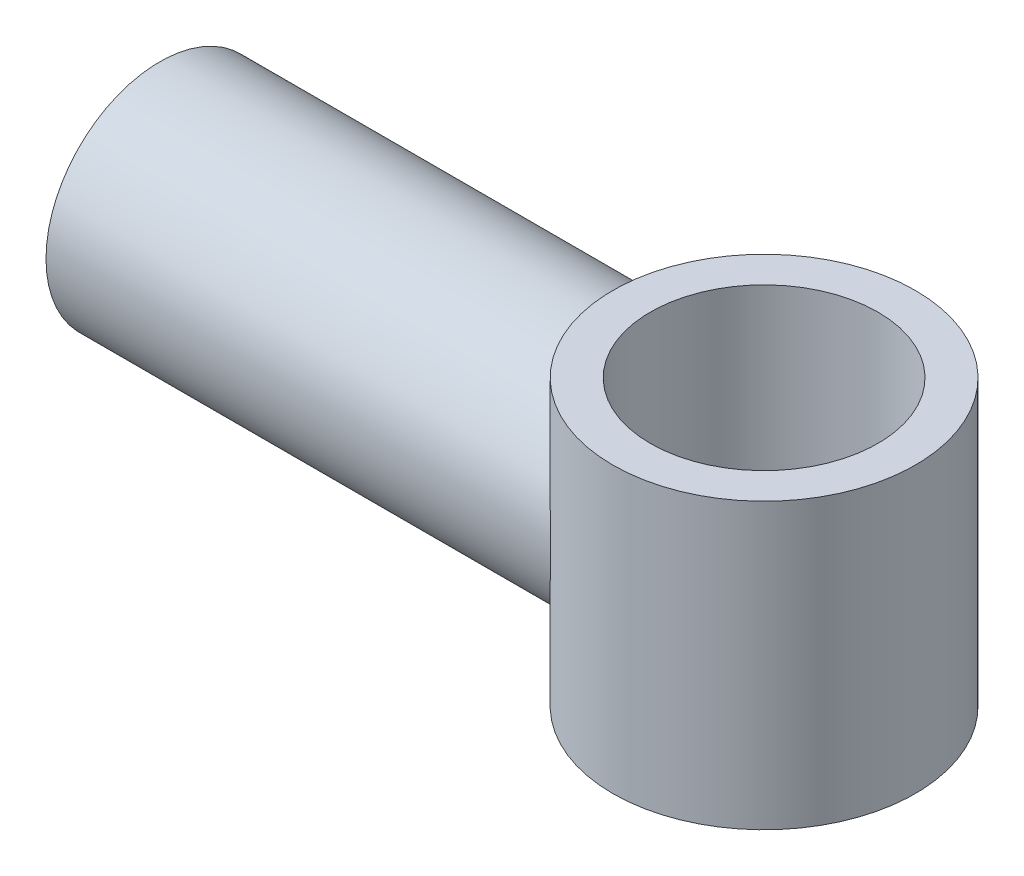
ISO-10303-21;
HEADER;
FILE_DESCRIPTION(('STEP AP214'),'2;1');
FILE_NAME('part.step','',(''),(''),'','','');
FILE_SCHEMA(('AUTOMOTIVE_DESIGN { 1 0 10303 214 1 1 1 1 }'));
ENDSEC;
DATA;
#1=APPLICATION_CONTEXT('core data for automotive mechanical design processes');
#2=APPLICATION_PROTOCOL_DEFINITION('international standard','automotive_design',2000,#1);
#3=PRODUCT_CONTEXT('',#1,'mechanical');
#4=PRODUCT('Part','Part','',(#3));
#5=PRODUCT_RELATED_PRODUCT_CATEGORY('part','',(#4));
#6=PRODUCT_DEFINITION_FORMATION('','',#4);
#7=PRODUCT_DEFINITION_CONTEXT('part definition',#1,'design');
#8=PRODUCT_DEFINITION('design','',#6,#7);
#9=PRODUCT_DEFINITION_SHAPE('','',#8);
#10=(LENGTH_UNIT() NAMED_UNIT(*) SI_UNIT(.MILLI.,.METRE.));
#11=(NAMED_UNIT(*) PLANE_ANGLE_UNIT() SI_UNIT($,.RADIAN.));
#12=(NAMED_UNIT(*) SI_UNIT($,.STERADIAN.) SOLID_ANGLE_UNIT());
#13=UNCERTAINTY_MEASURE_WITH_UNIT(LENGTH_MEASURE(1.E-05),#10,'distance_accuracy_value','');
#14=(GEOMETRIC_REPRESENTATION_CONTEXT(3) GLOBAL_UNCERTAINTY_ASSIGNED_CONTEXT((#13)) GLOBAL_UNIT_ASSIGNED_CONTEXT((#10,
#11,#12)) REPRESENTATION_CONTEXT('',''));
#15=CARTESIAN_POINT('',(0.,0.,0.));
#16=DIRECTION('',(0.,0.,1.));
#17=DIRECTION('',(1.,0.,0.));
#18=AXIS2_PLACEMENT_3D('',#15,#16,#17);
#19=CARTESIAN_POINT('',(0.,50.,0.));
#20=DIRECTION('',(0.,-1.,0.));
#21=DIRECTION('',(0.,0.,-1.));
#22=AXIS2_PLACEMENT_3D('',#19,#20,#21);
#23=CYLINDRICAL_SURFACE('',#22,53.1717026701568);
#24=CARTESIAN_POINT('',(0.,50.,0.));
#25=DIRECTION('',(0.,1.,0.));
#26=DIRECTION('',(0.,0.,1.));
#27=AXIS2_PLACEMENT_3D('',#24,#25,#26);
#28=CIRCLE('',#27,53.1717026701568);
#29=CARTESIAN_POINT('',(0.,50.,53.1717026701568));
#30=VERTEX_POINT('',#29);
#31=EDGE_CURVE('E49',#30,#30,#28,.T.);
#32=ORIENTED_EDGE('',*,*,#31,.F.);
#33=EDGE_LOOP('',(#32));
#34=FACE_BOUND('',#33,.T.);
#35=CARTESIAN_POINT('',(0.,-50.,0.));
#36=DIRECTION('',(0.,1.,0.));
#37=DIRECTION('',(0.,0.,1.));
#38=AXIS2_PLACEMENT_3D('',#35,#36,#37);
#39=CIRCLE('',#38,53.1717026701568);
#40=CARTESIAN_POINT('',(0.,-50.,53.1717026701568));
#41=VERTEX_POINT('',#40);
#42=EDGE_CURVE('E59',#41,#41,#39,.T.);
#43=ORIENTED_EDGE('',*,*,#42,.T.);
#44=EDGE_LOOP('',(#43));
#45=FACE_BOUND('',#44,.T.);
#46=CARTESIAN_POINT('',(-35.0318421560094,0.,40.));
#47=CARTESIAN_POINT('',(-35.0318360080921,0.466224832032186,40.0000029720039));
#48=CARTESIAN_POINT('',(-35.0411594107739,0.932404201727975,39.9918451445251));
#49=CARTESIAN_POINT('',(-35.0782886299255,1.86350962572313,39.9592828391426));
#50=CARTESIAN_POINT('',(-35.1060958003306,2.32843558570521,39.9348771710849));
#51=CARTESIAN_POINT('',(-35.1797748030917,3.25580537536783,39.8699864206307));
#52=CARTESIAN_POINT('',(-35.225649832424,3.71824875108666,39.8294984925842));
#53=CARTESIAN_POINT('',(-35.3347560969348,4.6394438489395,39.732734849922));
#54=CARTESIAN_POINT('',(-35.3979898411727,5.09819502752242,39.6764568529555));
#55=CARTESIAN_POINT('',(-35.612760760513,6.46945389131752,39.4841581380373));
#56=CARTESIAN_POINT('',(-35.7892036432933,7.37497997075151,39.3248137191437));
#57=CARTESIAN_POINT('',(-36.1992044252015,9.16016553642685,38.9477163480024));
#58=CARTESIAN_POINT('',(-36.4327639813452,10.0398242713994,38.7299617011939));
#59=CARTESIAN_POINT('',(-36.9431794562528,11.7571789778651,38.2433506456049));
#60=CARTESIAN_POINT('',(-37.2193696711163,12.5952947332021,37.9752681501788));
#61=CARTESIAN_POINT('',(-37.8078877948816,14.2406793213602,37.3893820283716));
#62=CARTESIAN_POINT('',(-38.1202147600129,15.0479489590463,37.0715797004293));
#63=CARTESIAN_POINT('',(-38.7722099756859,16.6305156876167,36.3891232481217));
#64=CARTESIAN_POINT('',(-39.1118685472709,17.4058239511874,36.0244856825088));
#65=CARTESIAN_POINT('',(-39.8109399008158,18.924464155715,35.2504058718305));
#66=CARTESIAN_POINT('',(-40.1703541236829,19.667793757194,34.840960356468));
#67=CARTESIAN_POINT('',(-40.9794726096933,21.2759759710889,33.8877793572696));
#68=CARTESIAN_POINT('',(-41.432211840636,22.1333300076736,33.3339468749483));
#69=CARTESIAN_POINT('',(-42.3461925373751,23.8003306416804,32.1648990643538));
#70=CARTESIAN_POINT('',(-42.807434702202,24.6099732935555,31.5496786708363));
#71=CARTESIAN_POINT('',(-43.7298156801524,26.1815205302343,30.2582832508677));
#72=CARTESIAN_POINT('',(-44.1909534174534,26.9433557293265,29.5820229506732));
#73=CARTESIAN_POINT('',(-45.1040128595465,28.4161162965938,28.1702831245609));
#74=CARTESIAN_POINT('',(-45.5559337896224,29.127037397709,27.4347986460715));
#75=CARTESIAN_POINT('',(-46.5341027759152,30.6363848648543,25.7477009563643));
#76=CARTESIAN_POINT('',(-47.0564398829022,31.4225867584502,24.7828109656896));
#77=CARTESIAN_POINT('',(-48.0626175511641,32.9102604318116,22.7701571015477));
#78=CARTESIAN_POINT('',(-48.546449369092,33.6117129862816,21.7223745128566));
#79=CARTESIAN_POINT('',(-49.2325188285781,34.5928488345494,20.0931838593558));
#80=CARTESIAN_POINT('',(-49.4544363268698,34.9078333289829,19.5409918691915));
#81=CARTESIAN_POINT('',(-49.8836370299662,35.5132782702058,18.4177626039244));
#82=CARTESIAN_POINT('',(-50.0909211249927,35.8037402090337,17.8467264783096));
#83=CARTESIAN_POINT('',(-50.4890916018598,36.3587091726904,16.6870381501323));
#84=CARTESIAN_POINT('',(-50.6799873944133,36.6232311057264,16.0983963227943));
#85=CARTESIAN_POINT('',(-51.0439606337523,37.1252722218448,14.9041561041875));
#86=CARTESIAN_POINT('',(-51.217033842119,37.3627849832245,14.2985537228543));
#87=CARTESIAN_POINT('',(-51.607976072231,37.897207337992,12.8307510913545));
#88=CARTESIAN_POINT('',(-51.8167340239405,38.1807974266192,11.96120611244));
#89=CARTESIAN_POINT('',(-52.1926733810507,38.6894632035225,10.1964794807991));
#90=CARTESIAN_POINT('',(-52.359864754566,38.9145529214083,9.30130403207072));
#91=CARTESIAN_POINT('',(-52.5769688335236,39.2060175768601,7.94370912894988));
#92=CARTESIAN_POINT('',(-52.6437142135703,39.2954657512606,7.48878719608915));
#93=CARTESIAN_POINT('',(-52.7656698076283,39.458698458359,6.57469813441233));
#94=CARTESIAN_POINT('',(-52.8208821347961,39.5324858605592,6.11553179941));
#95=CARTESIAN_POINT('',(-52.9687747568763,39.7299499153759,4.73262095303129));
#96=CARTESIAN_POINT('',(-53.0437250364697,39.8297476222911,3.8033753915287));
#97=CARTESIAN_POINT('',(-53.1447355973682,39.9641701424517,1.935151902209));
#98=CARTESIAN_POINT('',(-53.1706656596019,39.9986213677554,0.996154696161827));
#99=CARTESIAN_POINT('',(-53.1726784288906,40.0012972106355,-0.882016832105329));
#100=CARTESIAN_POINT('',(-53.1487613338823,39.9695220911883,-1.8211911536072));
#101=CARTESIAN_POINT('',(-53.051606426265,39.8402408009734,-3.69258679848788));
#102=CARTESIAN_POINT('',(-52.9783589721413,39.7427217806953,-4.62480672662615));
#103=CARTESIAN_POINT('',(-52.784156858037,39.483472721843,-6.47519798718179));
#104=CARTESIAN_POINT('',(-52.6632025325488,39.3217431334754,-7.39336941805206));
#105=CARTESIAN_POINT('',(-52.3811786737568,38.9432055112751,-9.1776550625902));
#106=CARTESIAN_POINT('',(-52.2216576808397,38.7285183381711,-10.0444674342689));
#107=CARTESIAN_POINT('',(-51.863567213659,38.2442962262208,-11.7542898246623));
#108=CARTESIAN_POINT('',(-51.6649989299066,37.9747629595659,-12.5973005681679));
#109=CARTESIAN_POINT('',(-51.2322457863857,37.383867009987,-14.2555743097466));
#110=CARTESIAN_POINT('',(-50.9980576804767,37.0624996031021,-15.0708347705585));
#111=CARTESIAN_POINT('',(-50.4978421998425,36.3711291587959,-16.6703398592023));
#112=CARTESIAN_POINT('',(-50.2318129415964,36.0011232441011,-17.454582648571));
#113=CARTESIAN_POINT('',(-49.6416257803749,35.1732035914988,-19.0724465314118));
#114=CARTESIAN_POINT('',(-49.3142929824772,34.7101119516588,-19.9022589790938));
#115=CARTESIAN_POINT('',(-48.6308820451753,33.7321078532698,-21.5182980934576));
#116=CARTESIAN_POINT('',(-48.2748021580392,33.2171922435175,-22.3045221051917));
#117=CARTESIAN_POINT('',(-47.5391977144989,32.1387769734327,-23.8322017510882));
#118=CARTESIAN_POINT('',(-47.1596574063362,31.5752445681927,-24.5736266310381));
#119=CARTESIAN_POINT('',(-46.3829453549651,30.4029666998105,-26.0099806743957));
#120=CARTESIAN_POINT('',(-45.9857727767498,29.7942190945028,-26.7049076318975));
#121=CARTESIAN_POINT('',(-45.0998355289723,28.4095390964178,-28.1800231074979));
#122=CARTESIAN_POINT('',(-44.608468344886,27.6243267346731,-28.9499596224516));
#123=CARTESIAN_POINT('',(-43.6186582700293,25.9956882913211,-30.4208580301369));
#124=CARTESIAN_POINT('',(-43.12021403764,25.1522510515604,-31.1218066393187));
#125=CARTESIAN_POINT('',(-42.1270206220268,23.4087534493967,-32.4535725757241));
#126=CARTESIAN_POINT('',(-41.6322736492788,22.5086618398324,-33.0843506608677));
#127=CARTESIAN_POINT('',(-40.6591793084432,20.6533975440956,-34.2731777220485));
#128=CARTESIAN_POINT('',(-40.1808283596298,19.6982370082119,-34.8312426534471));
#129=CARTESIAN_POINT('',(-39.3450307556117,17.9245099876765,-35.7702856781267));
#130=CARTESIAN_POINT('',(-38.9821717661404,17.1155366437212,-36.1645908712928));
#131=CARTESIAN_POINT('',(-38.2851409139984,15.4623354377748,-36.9016958186341));
#132=CARTESIAN_POINT('',(-37.9509688373177,14.6181078388571,-37.2444959570613));
#133=CARTESIAN_POINT('',(-37.3218539244472,12.8969424054593,-37.8748891117213));
#134=CARTESIAN_POINT('',(-37.0268394735577,12.0200681481467,-38.1625833495648));
#135=CARTESIAN_POINT('',(-36.4862972422397,10.2344013110003,-38.6797135282512));
#136=CARTESIAN_POINT('',(-36.2407562546812,9.32561732586308,-38.9091650214778));
#137=CARTESIAN_POINT('',(-35.853806896015,7.66670193010667,-39.2656218205582));
#138=CARTESIAN_POINT('',(-35.7013836370996,6.92156928759879,-39.4039570530465));
#139=CARTESIAN_POINT('',(-35.4404679344914,5.41711725952516,-39.6387960263289));
#140=CARTESIAN_POINT('',(-35.3319698277185,4.65779971597118,-39.7353051596946));
#141=CARTESIAN_POINT('',(-35.1632464712631,3.13037483314393,-39.8846944516366));
#142=CARTESIAN_POINT('',(-35.1029669707247,2.36227836115537,-39.9376236440682));
#143=CARTESIAN_POINT('',(-35.0330387076899,0.821969296647718,-39.9989797792235));
#144=CARTESIAN_POINT('',(-35.0233903948934,0.0497566676304017,-40.0074063266801));
#145=CARTESIAN_POINT('',(-35.0551610851182,-1.49319643907149,-39.9795706246441));
#146=CARTESIAN_POINT('',(-35.0966066521932,-2.26393594214417,-39.9432851290625));
#147=CARTESIAN_POINT('',(-35.2288081499679,-3.79775584836028,-39.8267336288623));
#148=CARTESIAN_POINT('',(-35.3195641459339,-4.56083624136489,-39.7464675660319));
#149=CARTESIAN_POINT('',(-35.5468674994627,-6.07548251228212,-39.5433093594356));
#150=CARTESIAN_POINT('',(-35.6834821524419,-6.82702976104223,-39.4203545628194));
#151=CARTESIAN_POINT('',(-35.9974762478346,-8.31364188532907,-39.1338309538183));
#152=CARTESIAN_POINT('',(-36.1748614563569,-9.0487044132955,-38.9702563963878));
#153=CARTESIAN_POINT('',(-36.6370586783061,-10.7685316055741,-38.5368651796099));
#154=CARTESIAN_POINT('',(-36.9373226336699,-11.7449089725073,-38.2501397277851));
#155=CARTESIAN_POINT('',(-37.5892635010574,-13.6576929120285,-37.6096507957327));
#156=CARTESIAN_POINT('',(-37.9409611316848,-14.5940831796226,-37.2558602831478));
#157=CARTESIAN_POINT('',(-38.6826891184745,-16.4262959242527,-36.4851465049999));
#158=CARTESIAN_POINT('',(-39.0727723001078,-17.3220599456737,-36.0681357982815));
#159=CARTESIAN_POINT('',(-39.8789377127442,-19.0709703537436,-35.1747399553402));
#160=CARTESIAN_POINT('',(-40.2950176089611,-19.9241205552263,-34.6983601472936));
#161=CARTESIAN_POINT('',(-41.1582782323898,-21.6176681528708,-33.6703536188596));
#162=CARTESIAN_POINT('',(-41.6060394188574,-22.4564961892298,-33.1166328753988));
#163=CARTESIAN_POINT('',(-42.5086466067456,-24.0876822413821,-31.9497905258514));
#164=CARTESIAN_POINT('',(-42.9634926318787,-24.8800401015997,-31.3366687209166));
#165=CARTESIAN_POINT('',(-43.8717325407211,-26.4174887996174,-30.0519583100444));
#166=CARTESIAN_POINT('',(-44.3251256888976,-27.1625584658296,-29.3803438309081));
#167=CARTESIAN_POINT('',(-45.2222668195599,-28.6031625967915,-27.9797847809088));
#168=CARTESIAN_POINT('',(-45.6660136813662,-29.2986913271528,-27.250833593776));
#169=CARTESIAN_POINT('',(-46.6345744015206,-30.7886785986114,-25.565453279138));
#170=CARTESIAN_POINT('',(-47.1550582087986,-31.5699950116779,-24.5948344247164));
#171=CARTESIAN_POINT('',(-48.156635374486,-33.0473329598133,-22.5708408637969));
#172=CARTESIAN_POINT('',(-48.6377196068655,-33.7433347520997,-21.5174470944371));
#173=CARTESIAN_POINT('',(-49.3190473389076,-34.7158693755115,-19.879913044653));
#174=CARTESIAN_POINT('',(-49.5393068741024,-35.0279521778271,-19.3248830840766));
#175=CARTESIAN_POINT('',(-49.9649589525964,-35.6274018891344,-18.1960569586298));
#176=CARTESIAN_POINT('',(-50.1703523950925,-35.9147702932101,-17.6222619318442));
#177=CARTESIAN_POINT('',(-50.5645088667604,-36.4633508075648,-16.4571686107743));
#178=CARTESIAN_POINT('',(-50.7532815537196,-36.7245781198068,-15.8658807514771));
#179=CARTESIAN_POINT('',(-51.1127794568546,-37.2198234696975,-14.6664868870585));
#180=CARTESIAN_POINT('',(-51.2835003910554,-37.4538350529347,-14.058376934609));
#181=CARTESIAN_POINT('',(-51.667953125545,-37.9788195005444,-12.5870584415525));
#182=CARTESIAN_POINT('',(-51.8725702841782,-38.2565224342576,-11.7166659897105));
#183=CARTESIAN_POINT('',(-52.2400644744276,-38.7533526272376,-9.95080140282294));
#184=CARTESIAN_POINT('',(-52.4029515148419,-38.9724939328159,-9.0553353388444));
#185=CARTESIAN_POINT('',(-52.6135348982715,-39.2550373549052,-7.69777777266261));
#186=CARTESIAN_POINT('',(-52.6780954888575,-39.3415113225541,-7.24295597709865));
#187=CARTESIAN_POINT('',(-52.7956728377562,-39.498807966775,-6.32922344824953));
#188=CARTESIAN_POINT('',(-52.848691718261,-39.569633520681,-5.87031348284295));
#189=CARTESIAN_POINT('',(-52.990007470392,-39.7582449140969,-4.48841031304441));
#190=CARTESIAN_POINT('',(-53.0605772154392,-39.8521839027135,-3.56015558760101));
#191=CARTESIAN_POINT('',(-53.1529180730856,-39.9750465507398,-1.69467887382966));
#192=CARTESIAN_POINT('',(-53.1745655811245,-40.0038055300104,-0.757440166758745));
#193=CARTESIAN_POINT('',(-53.1682332506411,-39.9953882409211,1.11660030118069));
#194=CARTESIAN_POINT('',(-53.140253618109,-39.9582122462413,2.05340206384672));
#195=CARTESIAN_POINT('',(-53.0352806280193,-39.818502482677,3.9195191057059));
#196=CARTESIAN_POINT('',(-52.9582767923634,-39.7159547416761,4.84883274142821));
#197=CARTESIAN_POINT('',(-52.7569402686285,-39.44708751213,6.69294966523445));
#198=CARTESIAN_POINT('',(-52.6326078120582,-39.2807683355236,7.60775302427283));
#199=CARTESIAN_POINT('',(-52.3439549521517,-38.893133258867,9.38759878550881));
#200=CARTESIAN_POINT('',(-52.1810475566028,-38.6737558847546,10.2532956516811));
#201=CARTESIAN_POINT('',(-51.8163918675118,-38.1803106790798,11.9604940430041));
#202=CARTESIAN_POINT('',(-51.6146446807524,-37.9062444059298,12.8019962568231));
#203=CARTESIAN_POINT('',(-51.1757811586576,-37.3064658560145,14.4569144909532));
#204=CARTESIAN_POINT('',(-50.9386617629216,-36.9807491103004,15.2703280735316));
#205=CARTESIAN_POINT('',(-50.4328583848408,-36.2808727506215,16.8658627761094));
#206=CARTESIAN_POINT('',(-50.1641725320105,-35.9067102658469,17.6479820380639));
#207=CARTESIAN_POINT('',(-49.5679291534919,-35.0691533272017,19.2632071292691));
#208=CARTESIAN_POINT('',(-49.2371471169329,-34.6004663275331,20.092377707367));
#209=CARTESIAN_POINT('',(-48.5470899650096,-33.6112420686542,21.706699288438));
#210=CARTESIAN_POINT('',(-48.1878130659203,-33.0907015629889,22.491847530436));
#211=CARTESIAN_POINT('',(-47.4461065315283,-32.0009777687301,24.0170041255837));
#212=CARTESIAN_POINT('',(-47.0636604870155,-31.4317598848329,24.756979723289));
#213=CARTESIAN_POINT('',(-46.2815029287211,-30.2480558876961,26.1900547956911));
#214=CARTESIAN_POINT('',(-45.8817906113298,-29.6335676665366,26.8831520847102));
#215=CARTESIAN_POINT('',(-44.9904856700914,-28.2357705233634,28.354273517983));
#216=CARTESIAN_POINT('',(-44.4963752794658,-27.4431302261621,29.1219289724948));
#217=CARTESIAN_POINT('',(-43.5018374157537,-25.7993864143568,30.5876550313669));
#218=CARTESIAN_POINT('',(-43.0014087086427,-24.9482713302859,31.2857117979954));
#219=CARTESIAN_POINT('',(-42.0052388184928,-23.1891389116143,32.6109996638048));
#220=CARTESIAN_POINT('',(-41.5095001981257,-22.2810923272534,33.2381938844482));
#221=CARTESIAN_POINT('',(-40.5356854737325,-20.4095697932911,34.4190848655216));
#222=CARTESIAN_POINT('',(-40.0576051613389,-19.446107192366,34.9727992204702));
#223=CARTESIAN_POINT('',(-39.2285275602167,-17.6672802976508,35.8978502226892));
#224=CARTESIAN_POINT('',(-38.8715639067994,-16.8620250506228,36.2833081249911));
#225=CARTESIAN_POINT('',(-38.1867250432431,-15.216940588129,37.0033889185851));
#226=CARTESIAN_POINT('',(-37.8588500099139,-14.3771111625555,37.3380115008927));
#227=CARTESIAN_POINT('',(-37.2426482455174,-12.665728634068,37.9526573733697));
#228=CARTESIAN_POINT('',(-36.9542389472671,-11.7942467433544,38.2327951865991));
#229=CARTESIAN_POINT('',(-36.4269059102164,-10.0202567326514,38.7355583012537));
#230=CARTESIAN_POINT('',(-36.187965447765,-9.11775921864018,38.9582030453521));
#231=CARTESIAN_POINT('',(-35.8279284163567,-7.53844696221809,39.2890782289));
#232=CARTESIAN_POINT('',(-35.6925001673956,-6.86793025171873,39.4119318113622));
#233=CARTESIAN_POINT('',(-35.4571144705814,-5.5154377807583,39.6238334867788));
#234=CARTESIAN_POINT('',(-35.3571509748851,-4.83346399487986,39.7128873438184));
#235=CARTESIAN_POINT('',(-35.1958876465989,-3.46179969073081,39.8558791452782));
#236=CARTESIAN_POINT('',(-35.1345592944791,-2.77211524794509,39.9098429932452));
#237=CARTESIAN_POINT('',(-35.0525373337807,-1.38825416045483,39.9819045550622));
#238=CARTESIAN_POINT('',(-35.0318513085168,-0.694076701651572,39.9999955755282));
#239=CARTESIAN_POINT('',(-35.0318421560094,0.,40.));
#240=B_SPLINE_CURVE_WITH_KNOTS('',3,(#46,#47,#48,#49,#50,#51,#52,#53,#54,#55,#56,#57,#58,#59,
#60,#61,#62,#63,#64,#65,#66,#67,#68,#69,#70,#71,#72,#73,#74,#75,#76,#77,#78,#79,#80,#81,#82,#83,
#84,#85,#86,#87,#88,#89,#90,#91,#92,#93,#94,#95,#96,#97,#98,#99,#100,#101,#102,#103,#104,#105,
#106,#107,#108,#109,#110,#111,#112,#113,#114,#115,#116,#117,#118,#119,#120,#121,#122,#123,#124,
#125,#126,#127,#128,#129,#130,#131,#132,#133,#134,#135,#136,#137,#138,#139,#140,#141,#142,#143,
#144,#145,#146,#147,#148,#149,#150,#151,#152,#153,#154,#155,#156,#157,#158,#159,#160,#161,#162,
#163,#164,#165,#166,#167,#168,#169,#170,#171,#172,#173,#174,#175,#176,#177,#178,#179,#180,#181,
#182,#183,#184,#185,#186,#187,#188,#189,#190,#191,#192,#193,#194,#195,#196,#197,#198,#199,#200,
#201,#202,#203,#204,#205,#206,#207,#208,#209,#210,#211,#212,#213,#214,#215,#216,#217,#218,#219,
#220,#221,#222,#223,#224,#225,#226,#227,#228,#229,#230,#231,#232,#233,#234,#235,#236,#237,#238,
#239),.UNSPECIFIED.,.T.,.F.,(4,2,2,2,2,2,2,2,2,2,2,2,2,2,2,2,2,2,2,2,2,2,2,2,2,2,2,2,2,2,2,2,2,
2,2,2,2,2,2,2,2,2,2,2,2,2,2,2,2,2,2,2,2,2,2,2,2,2,2,2,2,2,2,2,2,2,2,2,2,2,2,2,2,2,2,2,2,2,2,2,2,
2,2,2,2,2,2,2,2,2,2,2,2,2,2,2,4),(0.,1.3984313735308,2.79696519339662,4.1957465849154,
5.59473026534117,8.39866642445294,11.2026839383943,13.9666710393243,16.7305859704794,
19.4935263864593,22.2566685896163,25.6034968403357,28.95060147353,32.3024566602678,
35.6545924347113,39.698603136714,43.7435295025201,45.7628129892516,47.781973527005,
49.7999667294327,51.8184387313289,54.6298347598522,57.4405559334963,58.8454203575885,
60.2500271476067,63.0589645250655,65.8753532369025,68.6917307652455,71.5086589084492,
74.3255673013655,77.0440962107166,79.7625422478065,82.4812361735762,85.2000909996161,
88.2124483278065,91.2249889359037,94.2395746648974,97.2543033074628,100.864196507198,
104.474783433835,108.087379496455,111.69918151158,114.608077463298,117.516951712196,
120.420430431746,123.323133026617,125.639983372641,127.956534921966,130.270476433832,
132.58443849781,134.899604113838,137.214772794182,139.533353836494,141.852262993692,
145.03032580753,148.209672358567,151.393457139501,154.576956391992,157.875257868902,
161.17357038744,164.473349338826,167.773509622665,171.819129789628,175.865684399164,
177.886272798645,179.906738877642,181.92602307196,183.945785182118,186.751509188103,
189.556559621324,190.958535853592,192.360254084163,195.163417870786,197.973656115265,
200.783882695152,203.594710115402,206.405523786622,209.126035266858,211.846469234592,
214.567138710722,217.287969482821,220.309884652259,223.331989137439,226.356259590229,
229.380670951057,233.00410753068,236.628263097628,240.254296156295,243.879459400271,
246.761762544519,249.644083207134,252.520278364106,255.39549958849,257.478874306346,
259.561893573069,261.643373397963,263.72524156229),.UNSPECIFIED.);
#241=CARTESIAN_POINT('',(-35.0318421560094,0.,40.));
#242=VERTEX_POINT('',#241);
#243=EDGE_CURVE('E10',#242,#242,#240,.T.);
#244=ORIENTED_EDGE('',*,*,#243,.F.);
#245=EDGE_LOOP('',(#244));
#246=FACE_BOUND('',#245,.T.);
#247=ADVANCED_FACE('F37',(#34,#45,#246),#23,.T.);
#248=CARTESIAN_POINT('',(0.,50.,0.));
#249=DIRECTION('',(0.,1.,0.));
#250=DIRECTION('',(0.,0.,1.));
#251=AXIS2_PLACEMENT_3D('',#248,#249,#250);
#252=PLANE('',#251);
#253=ORIENTED_EDGE('',*,*,#31,.T.);
#254=EDGE_LOOP('',(#253));
#255=FACE_BOUND('',#254,.T.);
#256=CARTESIAN_POINT('',(0.,50.,0.));
#257=DIRECTION('',(0.,1.,0.));
#258=DIRECTION('',(0.,0.,1.));
#259=AXIS2_PLACEMENT_3D('',#256,#257,#258);
#260=CIRCLE('',#259,40.);
#261=CARTESIAN_POINT('',(0.,50.,-40.));
#262=VERTEX_POINT('',#261);
#263=EDGE_CURVE('E54',#262,#262,#260,.T.);
#264=ORIENTED_EDGE('',*,*,#263,.F.);
#265=EDGE_LOOP('',(#264));
#266=FACE_BOUND('',#265,.T.);
#267=ADVANCED_FACE('F88',(#255,#266),#252,.T.);
#268=CARTESIAN_POINT('',(0.,50.,0.));
#269=DIRECTION('',(0.,-1.,0.));
#270=DIRECTION('',(0.,0.,-1.));
#271=AXIS2_PLACEMENT_3D('',#268,#269,#270);
#272=CYLINDRICAL_SURFACE('',#271,40.);
#273=CARTESIAN_POINT('',(0.,-50.,0.));
#274=DIRECTION('',(0.,1.,0.));
#275=DIRECTION('',(0.,0.,1.));
#276=AXIS2_PLACEMENT_3D('',#273,#274,#275);
#277=CIRCLE('',#276,40.);
#278=CARTESIAN_POINT('',(0.,-50.,-40.));
#279=VERTEX_POINT('',#278);
#280=EDGE_CURVE('E65',#279,#279,#277,.T.);
#281=CARTESIAN_POINT('',(0.,50.,-40.));
#282=CARTESIAN_POINT('',(0.,48.9583333333333,-40.));
#283=CARTESIAN_POINT('',(0.,47.9166666666667,-40.));
#284=CARTESIAN_POINT('',(0.,45.8333333333333,-40.));
#285=CARTESIAN_POINT('',(0.,44.7916666666667,-40.));
#286=CARTESIAN_POINT('',(0.,42.7083333333333,-40.));
#287=CARTESIAN_POINT('',(0.,41.6666666666667,-40.));
#288=CARTESIAN_POINT('',(0.,39.5833333333333,-40.));
#289=CARTESIAN_POINT('',(0.,38.5416666666667,-40.));
#290=CARTESIAN_POINT('',(0.,36.4583333333333,-40.));
#291=CARTESIAN_POINT('',(0.,35.4166666666667,-40.));
#292=CARTESIAN_POINT('',(0.,33.3333333333333,-40.));
#293=CARTESIAN_POINT('',(0.,32.2916666666667,-40.));
#294=CARTESIAN_POINT('',(0.,30.2083333333333,-40.));
#295=CARTESIAN_POINT('',(0.,29.1666666666667,-40.));
#296=CARTESIAN_POINT('',(0.,27.0833333333333,-40.));
#297=CARTESIAN_POINT('',(0.,26.0416666666667,-40.));
#298=CARTESIAN_POINT('',(0.,23.9583333333333,-40.));
#299=CARTESIAN_POINT('',(0.,22.9166666666667,-40.));
#300=CARTESIAN_POINT('',(0.,20.8333333333333,-40.));
#301=CARTESIAN_POINT('',(0.,19.7916666666667,-40.));
#302=CARTESIAN_POINT('',(0.,17.7083333333333,-40.));
#303=CARTESIAN_POINT('',(0.,16.6666666666667,-40.));
#304=CARTESIAN_POINT('',(0.,14.5833333333333,-40.));
#305=CARTESIAN_POINT('',(0.,13.5416666666667,-40.));
#306=CARTESIAN_POINT('',(0.,11.4583333333333,-40.));
#307=CARTESIAN_POINT('',(0.,10.4166666666667,-40.));
#308=CARTESIAN_POINT('',(0.,8.33333333333333,-40.));
#309=CARTESIAN_POINT('',(0.,7.29166666666666,-40.));
#310=CARTESIAN_POINT('',(0.,5.20833333333333,-40.));
#311=CARTESIAN_POINT('',(0.,4.16666666666666,-40.));
#312=CARTESIAN_POINT('',(0.,2.08333333333333,-40.));
#313=CARTESIAN_POINT('',(0.,1.04166666666666,-40.));
#314=CARTESIAN_POINT('',(0.,-1.04166666666667,-40.));
#315=CARTESIAN_POINT('',(0.,-2.08333333333334,-40.));
#316=CARTESIAN_POINT('',(0.,-4.16666666666667,-40.));
#317=CARTESIAN_POINT('',(0.,-5.20833333333334,-40.));
#318=CARTESIAN_POINT('',(0.,-7.29166666666667,-40.));
#319=CARTESIAN_POINT('',(0.,-8.33333333333334,-40.));
#320=CARTESIAN_POINT('',(0.,-10.4166666666667,-40.));
#321=CARTESIAN_POINT('',(0.,-11.4583333333333,-40.));
#322=CARTESIAN_POINT('',(0.,-13.5416666666667,-40.));
#323=CARTESIAN_POINT('',(0.,-14.5833333333333,-40.));
#324=CARTESIAN_POINT('',(0.,-16.6666666666667,-40.));
#325=CARTESIAN_POINT('',(0.,-17.7083333333333,-40.));
#326=CARTESIAN_POINT('',(0.,-19.7916666666667,-40.));
#327=CARTESIAN_POINT('',(0.,-20.8333333333333,-40.));
#328=CARTESIAN_POINT('',(0.,-22.9166666666667,-40.));
#329=CARTESIAN_POINT('',(0.,-23.9583333333333,-40.));
#330=CARTESIAN_POINT('',(0.,-26.0416666666667,-40.));
#331=CARTESIAN_POINT('',(0.,-27.0833333333333,-40.));
#332=CARTESIAN_POINT('',(0.,-29.1666666666667,-40.));
#333=CARTESIAN_POINT('',(0.,-30.2083333333333,-40.));
#334=CARTESIAN_POINT('',(0.,-32.2916666666667,-40.));
#335=CARTESIAN_POINT('',(0.,-33.3333333333333,-40.));
#336=CARTESIAN_POINT('',(0.,-35.4166666666667,-40.));
#337=CARTESIAN_POINT('',(0.,-36.4583333333333,-40.));
#338=CARTESIAN_POINT('',(0.,-38.5416666666667,-40.));
#339=CARTESIAN_POINT('',(0.,-39.5833333333333,-40.));
#340=CARTESIAN_POINT('',(0.,-41.6666666666667,-40.));
#341=CARTESIAN_POINT('',(0.,-42.7083333333333,-40.));
#342=CARTESIAN_POINT('',(0.,-44.7916666666667,-40.));
#343=CARTESIAN_POINT('',(0.,-45.8333333333333,-40.));
#344=CARTESIAN_POINT('',(0.,-47.9166666666667,-40.));
#345=CARTESIAN_POINT('',(0.,-48.9583333333333,-40.));
#346=CARTESIAN_POINT('',(0.,-50.,-40.));
#347=B_SPLINE_CURVE_WITH_KNOTS('',3,(#281,#282,#283,#284,#285,#286,#287,#288,#289,#290,#291,
#292,#293,#294,#295,#296,#297,#298,#299,#300,#301,#302,#303,#304,#305,#306,#307,#308,#309,#310,
#311,#312,#313,#314,#315,#316,#317,#318,#319,#320,#321,#322,#323,#324,#325,#326,#327,#328,#329,
#330,#331,#332,#333,#334,#335,#336,#337,#338,#339,#340,#341,#342,#343,#344,#345,#346),
.UNSPECIFIED.,.F.,.F.,(4,2,2,2,2,2,2,2,2,2,2,2,2,2,2,2,2,2,2,2,2,2,2,2,2,2,2,2,2,2,2,2,4),(0.,
3.125,6.25,9.37499999999999,12.5,15.625,18.75,21.875,25.,28.125,31.25,34.375,37.5,40.625,43.75,
46.875,50.,53.125,56.25,59.375,62.5,65.625,68.75,71.875,75.,78.125,81.25,84.375,87.5,90.625,
93.75,96.875,100.),.UNSPECIFIED.);
#348=EDGE_CURVE('BSEAM84',#262,#279,#347,.T.);
#349=ORIENTED_EDGE('',*,*,#263,.T.);
#350=ORIENTED_EDGE('',*,*,#280,.F.);
#351=ORIENTED_EDGE('',*,*,#348,.T.);
#352=ORIENTED_EDGE('',*,*,#348,.F.);
#353=EDGE_LOOP('',(#349,#351,#350,#352));
#354=FACE_BOUND('',#353,.T.);
#355=ADVANCED_FACE('F84',(#354),#272,.F.);
#356=CARTESIAN_POINT('',(0.,-50.,0.));
#357=DIRECTION('',(0.,1.,0.));
#358=DIRECTION('',(0.,0.,1.));
#359=AXIS2_PLACEMENT_3D('',#356,#357,#358);
#360=PLANE('',#359);
#361=ORIENTED_EDGE('',*,*,#280,.T.);
#362=EDGE_LOOP('',(#361));
#363=FACE_BOUND('',#362,.T.);
#364=ORIENTED_EDGE('',*,*,#42,.F.);
#365=EDGE_LOOP('',(#364));
#366=FACE_BOUND('',#365,.T.);
#367=ADVANCED_FACE('F78',(#363,#366),#360,.F.);
#368=CARTESIAN_POINT('',(-212.4,0.,0.));
#369=DIRECTION('',(1.,0.,0.));
#370=DIRECTION('',(0.,0.,-1.));
#371=AXIS2_PLACEMENT_3D('',#368,#369,#370);
#372=PLANE('',#371);
#373=CARTESIAN_POINT('',(-212.4,0.,0.));
#374=DIRECTION('',(1.,0.,0.));
#375=DIRECTION('',(0.,0.,-1.));
#376=AXIS2_PLACEMENT_3D('',#373,#374,#375);
#377=CIRCLE('',#376,40.);
#378=CARTESIAN_POINT('',(-212.4,0.,-40.));
#379=VERTEX_POINT('',#378);
#380=EDGE_CURVE('E69',#379,#379,#377,.T.);
#381=ORIENTED_EDGE('',*,*,#380,.F.);
#382=EDGE_LOOP('',(#381));
#383=FACE_BOUND('',#382,.T.);
#384=ADVANCED_FACE('F76',(#383),#372,.F.);
#385=CARTESIAN_POINT('',(53.1727026701568,0.,0.));
#386=DIRECTION('',(-1.,0.,0.));
#387=DIRECTION('',(0.,0.,1.));
#388=AXIS2_PLACEMENT_3D('',#385,#386,#387);
#389=CYLINDRICAL_SURFACE('',#388,40.);
#390=ORIENTED_EDGE('',*,*,#380,.T.);
#391=EDGE_LOOP('',(#390));
#392=FACE_BOUND('',#391,.T.);
#393=ORIENTED_EDGE('',*,*,#243,.T.);
#394=EDGE_LOOP('',(#393));
#395=FACE_BOUND('',#394,.T.);
#396=ADVANCED_FACE('F74',(#392,#395),#389,.T.);
#397=CLOSED_SHELL('',(#247,#267,#355,#367,#384,#396));
#398=MANIFOLD_SOLID_BREP('B2',#397);
#399=ADVANCED_BREP_SHAPE_REPRESENTATION('',(#18,#398),#14);
#400=SHAPE_DEFINITION_REPRESENTATION(#9,#399);
ENDSEC;
END-ISO-10303-21;
